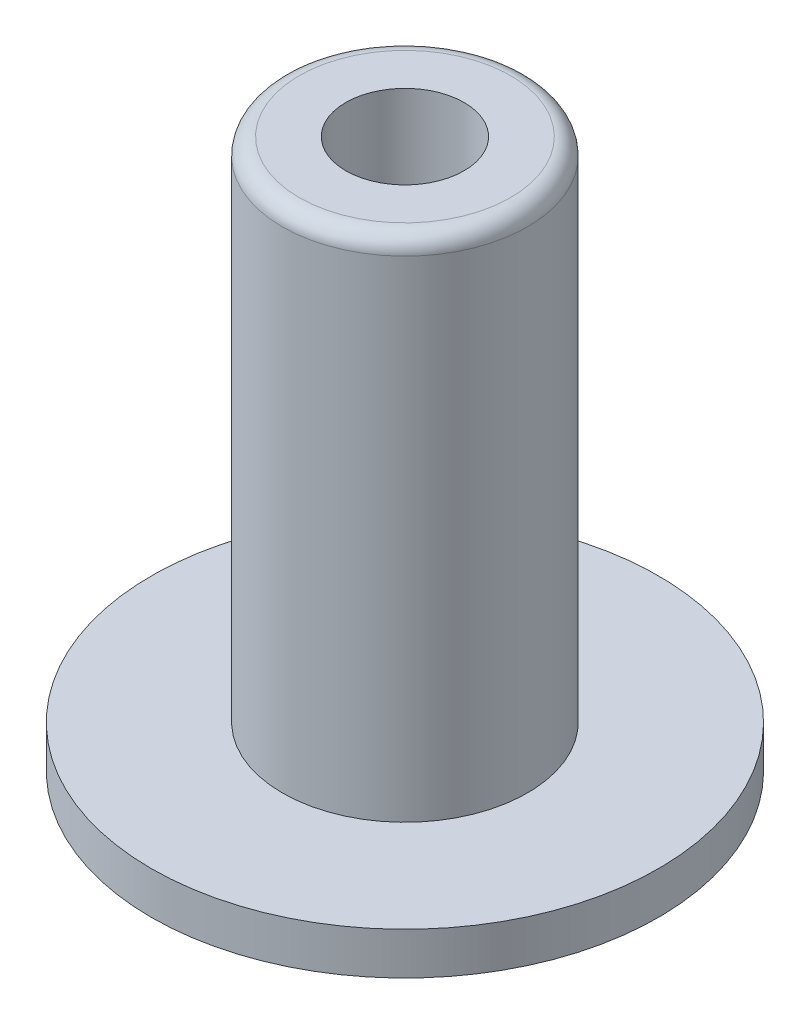
ISO-10303-21;
HEADER;
FILE_DESCRIPTION(('STEP AP214'),'2;1');
FILE_NAME('part.step','',(''),(''),'','','');
FILE_SCHEMA(('AUTOMOTIVE_DESIGN { 1 0 10303 214 1 1 1 1 }'));
ENDSEC;
DATA;
#1=APPLICATION_CONTEXT('core data for automotive mechanical design processes');
#2=APPLICATION_PROTOCOL_DEFINITION('international standard','automotive_design',2000,#1);
#3=PRODUCT_CONTEXT('',#1,'mechanical');
#4=PRODUCT('Part','Part','',(#3));
#5=PRODUCT_RELATED_PRODUCT_CATEGORY('part','',(#4));
#6=PRODUCT_DEFINITION_FORMATION('','',#4);
#7=PRODUCT_DEFINITION_CONTEXT('part definition',#1,'design');
#8=PRODUCT_DEFINITION('design','',#6,#7);
#9=PRODUCT_DEFINITION_SHAPE('','',#8);
#10=(LENGTH_UNIT() NAMED_UNIT(*) SI_UNIT(.MILLI.,.METRE.));
#11=(NAMED_UNIT(*) PLANE_ANGLE_UNIT() SI_UNIT($,.RADIAN.));
#12=(NAMED_UNIT(*) SI_UNIT($,.STERADIAN.) SOLID_ANGLE_UNIT());
#13=UNCERTAINTY_MEASURE_WITH_UNIT(LENGTH_MEASURE(1.E-05),#10,'distance_accuracy_value','');
#14=(GEOMETRIC_REPRESENTATION_CONTEXT(3) GLOBAL_UNCERTAINTY_ASSIGNED_CONTEXT((#13)) GLOBAL_UNIT_ASSIGNED_CONTEXT((#10,
#11,#12)) REPRESENTATION_CONTEXT('',''));
#15=CARTESIAN_POINT('',(0.,0.,0.));
#16=DIRECTION('',(0.,0.,1.));
#17=DIRECTION('',(1.,0.,0.));
#18=AXIS2_PLACEMENT_3D('',#15,#16,#17);
#19=CARTESIAN_POINT('',(0.,-5.,0.));
#20=DIRECTION('',(0.,1.,0.));
#21=DIRECTION('',(0.,0.,1.));
#22=AXIS2_PLACEMENT_3D('',#19,#20,#21);
#23=CYLINDRICAL_SURFACE('',#22,10.);
#24=CARTESIAN_POINT('',(0.,-3.5,0.));
#25=DIRECTION('',(0.,1.,0.));
#26=DIRECTION('',(0.,0.,1.));
#27=AXIS2_PLACEMENT_3D('',#24,#25,#26);
#28=CIRCLE('',#27,10.);
#29=CARTESIAN_POINT('',(0.,-3.5,10.));
#30=VERTEX_POINT('',#29);
#31=EDGE_CURVE('E60',#30,#30,#28,.F.);
#32=ORIENTED_EDGE('',*,*,#31,.T.);
#33=EDGE_LOOP('',(#32));
#34=FACE_BOUND('',#33,.T.);
#35=CARTESIAN_POINT('',(0.,-4.,0.));
#36=DIRECTION('',(0.,-1.,0.));
#37=DIRECTION('',(0.,0.,-1.));
#38=AXIS2_PLACEMENT_3D('',#35,#36,#37);
#39=CIRCLE('',#38,10.);
#40=CARTESIAN_POINT('',(0.,-4.,-10.));
#41=VERTEX_POINT('',#40);
#42=EDGE_CURVE('E63',#41,#41,#39,.F.);
#43=ORIENTED_EDGE('',*,*,#42,.T.);
#44=EDGE_LOOP('',(#43));
#45=FACE_BOUND('',#44,.T.);
#46=ADVANCED_FACE('F37',(#34,#45),#23,.T.);
#47=CARTESIAN_POINT('',(0.,30.,0.));
#48=DIRECTION('',(0.,1.,0.));
#49=DIRECTION('',(0.,0.,1.));
#50=AXIS2_PLACEMENT_3D('',#47,#48,#49);
#51=PLANE('',#50);
#52=CARTESIAN_POINT('',(0.,30.,0.));
#53=DIRECTION('',(0.,1.,0.));
#54=DIRECTION('',(0.,0.,1.));
#55=AXIS2_PLACEMENT_3D('',#52,#53,#54);
#56=CIRCLE('',#55,6.25);
#57=CARTESIAN_POINT('',(0.,30.,6.25));
#58=VERTEX_POINT('',#57);
#59=EDGE_CURVE('E44',#58,#58,#56,.T.);
#60=ORIENTED_EDGE('',*,*,#59,.T.);
#61=EDGE_LOOP('',(#60));
#62=FACE_BOUND('',#61,.T.);
#63=CARTESIAN_POINT('',(0.,30.,0.));
#64=DIRECTION('',(0.,1.,0.));
#65=DIRECTION('',(0.,0.,1.));
#66=AXIS2_PLACEMENT_3D('',#63,#64,#65);
#67=CIRCLE('',#66,3.5);
#68=CARTESIAN_POINT('',(0.,30.,3.5));
#69=VERTEX_POINT('',#68);
#70=EDGE_CURVE('E69',#69,#69,#67,.T.);
#71=ORIENTED_EDGE('',*,*,#70,.F.);
#72=EDGE_LOOP('',(#71));
#73=FACE_BOUND('',#72,.T.);
#74=ADVANCED_FACE('F100',(#62,#73),#51,.T.);
#75=CARTESIAN_POINT('',(0.,30.,0.));
#76=DIRECTION('',(0.,-1.,0.));
#77=DIRECTION('',(0.,0.,-1.));
#78=AXIS2_PLACEMENT_3D('',#75,#76,#77);
#79=CYLINDRICAL_SURFACE('',#78,7.25);
#80=CARTESIAN_POINT('',(0.,29.,0.));
#81=DIRECTION('',(0.,1.,0.));
#82=DIRECTION('',(0.,0.,1.));
#83=AXIS2_PLACEMENT_3D('',#80,#81,#82);
#84=CIRCLE('',#83,7.25);
#85=CARTESIAN_POINT('',(0.,29.,7.25));
#86=VERTEX_POINT('',#85);
#87=EDGE_CURVE('E10',#86,#86,#84,.F.);
#88=ORIENTED_EDGE('',*,*,#87,.T.);
#89=EDGE_LOOP('',(#88));
#90=FACE_BOUND('',#89,.T.);
#91=CARTESIAN_POINT('',(0.,0.,0.));
#92=DIRECTION('',(0.,1.,0.));
#93=DIRECTION('',(0.,0.,1.));
#94=AXIS2_PLACEMENT_3D('',#91,#92,#93);
#95=CIRCLE('',#94,7.25);
#96=CARTESIAN_POINT('',(0.,0.,7.25));
#97=VERTEX_POINT('',#96);
#98=EDGE_CURVE('E70',#97,#97,#95,.T.);
#99=ORIENTED_EDGE('',*,*,#98,.T.);
#100=EDGE_LOOP('',(#99));
#101=FACE_BOUND('',#100,.T.);
#102=ADVANCED_FACE('F106',(#90,#101),#79,.T.);
#103=CARTESIAN_POINT('',(0.,30.,0.));
#104=DIRECTION('',(0.,-1.,0.));
#105=DIRECTION('',(0.,0.,-1.));
#106=AXIS2_PLACEMENT_3D('',#103,#104,#105);
#107=CYLINDRICAL_SURFACE('',#106,3.5);
#108=CARTESIAN_POINT('',(0.,-4.,0.));
#109=DIRECTION('',(0.,-1.,0.));
#110=DIRECTION('',(0.,0.,-1.));
#111=AXIS2_PLACEMENT_3D('',#108,#109,#110);
#112=CIRCLE('',#111,3.5);
#113=CARTESIAN_POINT('',(0.,-4.,-3.5));
#114=VERTEX_POINT('',#113);
#115=EDGE_CURVE('E57',#114,#114,#112,.T.);
#116=ORIENTED_EDGE('',*,*,#115,.T.);
#117=EDGE_LOOP('',(#116));
#118=FACE_BOUND('',#117,.T.);
#119=ORIENTED_EDGE('',*,*,#70,.T.);
#120=EDGE_LOOP('',(#119));
#121=FACE_BOUND('',#120,.T.);
#122=ADVANCED_FACE('F112',(#118,#121),#107,.F.);
#123=CARTESIAN_POINT('',(0.,-5.,0.));
#124=DIRECTION('',(0.,-1.,0.));
#125=DIRECTION('',(0.,0.,-1.));
#126=AXIS2_PLACEMENT_3D('',#123,#124,#125);
#127=PLANE('',#126);
#128=CARTESIAN_POINT('',(0.,-5.,0.));
#129=DIRECTION('',(0.,-1.,0.));
#130=DIRECTION('',(0.,0.,-1.));
#131=AXIS2_PLACEMENT_3D('',#128,#129,#130);
#132=CIRCLE('',#131,4.5);
#133=CARTESIAN_POINT('',(0.,-5.,-4.5));
#134=VERTEX_POINT('',#133);
#135=EDGE_CURVE('E48',#134,#134,#132,.F.);
#136=ORIENTED_EDGE('',*,*,#135,.T.);
#137=EDGE_LOOP('',(#136));
#138=FACE_BOUND('',#137,.T.);
#139=CARTESIAN_POINT('',(0.,-5.,0.));
#140=DIRECTION('',(0.,-1.,0.));
#141=DIRECTION('',(0.,0.,-1.));
#142=AXIS2_PLACEMENT_3D('',#139,#140,#141);
#143=CIRCLE('',#142,9.);
#144=CARTESIAN_POINT('',(0.,-5.,-9.));
#145=VERTEX_POINT('',#144);
#146=EDGE_CURVE('E52',#145,#145,#143,.T.);
#147=ORIENTED_EDGE('',*,*,#146,.T.);
#148=EDGE_LOOP('',(#147));
#149=FACE_BOUND('',#148,.T.);
#150=ADVANCED_FACE('F114',(#138,#149),#127,.T.);
#151=CARTESIAN_POINT('',(0.,0.,0.));
#152=DIRECTION('',(0.,-1.,0.));
#153=DIRECTION('',(0.,0.,-1.));
#154=AXIS2_PLACEMENT_3D('',#151,#152,#153);
#155=PLANE('',#154);
#156=ORIENTED_EDGE('',*,*,#98,.F.);
#157=EDGE_LOOP('',(#156));
#158=FACE_BOUND('',#157,.T.);
#159=CARTESIAN_POINT('',(0.,0.,0.));
#160=DIRECTION('',(0.,1.,0.));
#161=DIRECTION('',(0.,0.,1.));
#162=AXIS2_PLACEMENT_3D('',#159,#160,#161);
#163=CIRCLE('',#162,15.);
#164=CARTESIAN_POINT('',(0.,0.,15.));
#165=VERTEX_POINT('',#164);
#166=EDGE_CURVE('E76',#165,#165,#163,.T.);
#167=ORIENTED_EDGE('',*,*,#166,.T.);
#168=EDGE_LOOP('',(#167));
#169=FACE_BOUND('',#168,.T.);
#170=ADVANCED_FACE('F97',(#158,#169),#155,.F.);
#171=CARTESIAN_POINT('',(0.,-2.5,0.));
#172=DIRECTION('',(0.,1.,0.));
#173=DIRECTION('',(0.,0.,1.));
#174=AXIS2_PLACEMENT_3D('',#171,#172,#173);
#175=CYLINDRICAL_SURFACE('',#174,15.);
#176=CARTESIAN_POINT('',(0.,-2.5,0.));
#177=DIRECTION('',(0.,1.,0.));
#178=DIRECTION('',(0.,0.,1.));
#179=AXIS2_PLACEMENT_3D('',#176,#177,#178);
#180=CIRCLE('',#179,15.);
#181=CARTESIAN_POINT('',(0.,-2.5,15.));
#182=VERTEX_POINT('',#181);
#183=EDGE_CURVE('E73',#182,#182,#180,.T.);
#184=ORIENTED_EDGE('',*,*,#183,.T.);
#185=EDGE_LOOP('',(#184));
#186=FACE_BOUND('',#185,.T.);
#187=ORIENTED_EDGE('',*,*,#166,.F.);
#188=EDGE_LOOP('',(#187));
#189=FACE_BOUND('',#188,.T.);
#190=ADVANCED_FACE('F82',(#186,#189),#175,.T.);
#191=CARTESIAN_POINT('',(0.,-2.5,0.));
#192=DIRECTION('',(0.,1.,0.));
#193=DIRECTION('',(0.,0.,1.));
#194=AXIS2_PLACEMENT_3D('',#191,#192,#193);
#195=PLANE('',#194);
#196=CARTESIAN_POINT('',(0.,-2.5,0.));
#197=DIRECTION('',(0.,1.,0.));
#198=DIRECTION('',(0.,0.,1.));
#199=AXIS2_PLACEMENT_3D('',#196,#197,#198);
#200=CIRCLE('',#199,11.);
#201=CARTESIAN_POINT('',(0.,-2.5,11.));
#202=VERTEX_POINT('',#201);
#203=EDGE_CURVE('E66',#202,#202,#200,.T.);
#204=ORIENTED_EDGE('',*,*,#203,.T.);
#205=EDGE_LOOP('',(#204));
#206=FACE_BOUND('',#205,.T.);
#207=ORIENTED_EDGE('',*,*,#183,.F.);
#208=EDGE_LOOP('',(#207));
#209=FACE_BOUND('',#208,.T.);
#210=ADVANCED_FACE('F85',(#206,#209),#195,.F.);
#211=CARTESIAN_POINT('',(0.,-3.5,0.));
#212=DIRECTION('',(0.,1.,0.));
#213=DIRECTION('',(0.,0.,1.));
#214=AXIS2_PLACEMENT_3D('',#211,#212,#213);
#215=TOROIDAL_SURFACE('',#214,11.,1.);
#216=ORIENTED_EDGE('',*,*,#31,.F.);
#217=EDGE_LOOP('',(#216));
#218=FACE_BOUND('',#217,.T.);
#219=ORIENTED_EDGE('',*,*,#203,.F.);
#220=EDGE_LOOP('',(#219));
#221=FACE_BOUND('',#220,.T.);
#222=ADVANCED_FACE('F87',(#218,#221),#215,.F.);
#223=CARTESIAN_POINT('',(0.,-4.,0.));
#224=DIRECTION('',(0.,-1.,0.));
#225=DIRECTION('',(0.,0.,-1.));
#226=AXIS2_PLACEMENT_3D('',#223,#224,#225);
#227=TOROIDAL_SURFACE('',#226,4.5,1.);
#228=ORIENTED_EDGE('',*,*,#135,.F.);
#229=EDGE_LOOP('',(#228));
#230=FACE_BOUND('',#229,.T.);
#231=ORIENTED_EDGE('',*,*,#115,.F.);
#232=EDGE_LOOP('',(#231));
#233=FACE_BOUND('',#232,.T.);
#234=ADVANCED_FACE('F94',(#230,#233),#227,.T.);
#235=CARTESIAN_POINT('',(0.,-4.,0.));
#236=DIRECTION('',(0.,-1.,0.));
#237=DIRECTION('',(0.,0.,-1.));
#238=AXIS2_PLACEMENT_3D('',#235,#236,#237);
#239=TOROIDAL_SURFACE('',#238,9.,1.);
#240=ORIENTED_EDGE('',*,*,#42,.F.);
#241=EDGE_LOOP('',(#240));
#242=FACE_BOUND('',#241,.T.);
#243=ORIENTED_EDGE('',*,*,#146,.F.);
#244=EDGE_LOOP('',(#243));
#245=FACE_BOUND('',#244,.T.);
#246=ADVANCED_FACE('F120',(#242,#245),#239,.T.);
#247=CARTESIAN_POINT('',(0.,29.,0.));
#248=DIRECTION('',(0.,1.,0.));
#249=DIRECTION('',(0.,0.,1.));
#250=AXIS2_PLACEMENT_3D('',#247,#248,#249);
#251=TOROIDAL_SURFACE('',#250,6.25,1.);
#252=ORIENTED_EDGE('',*,*,#87,.F.);
#253=EDGE_LOOP('',(#252));
#254=FACE_BOUND('',#253,.T.);
#255=ORIENTED_EDGE('',*,*,#59,.F.);
#256=EDGE_LOOP('',(#255));
#257=FACE_BOUND('',#256,.T.);
#258=ADVANCED_FACE('F39',(#254,#257),#251,.T.);
#259=CLOSED_SHELL('',(#46,#74,#102,#122,#150,#170,#190,#210,#222,#234,#246,#258));
#260=MANIFOLD_SOLID_BREP('B2',#259);
#261=ADVANCED_BREP_SHAPE_REPRESENTATION('',(#18,#260),#14);
#262=SHAPE_DEFINITION_REPRESENTATION(#9,#261);
ENDSEC;
END-ISO-10303-21;
